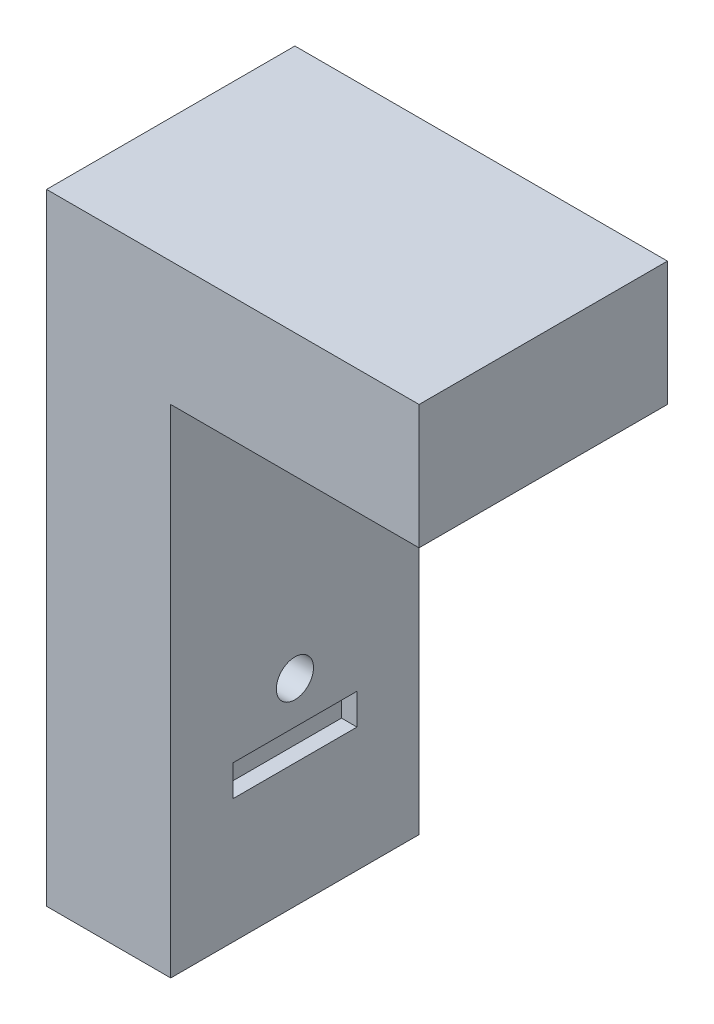
ISO-10303-21;
HEADER;
FILE_DESCRIPTION(('STEP AP214'),'2;1');
FILE_NAME('part.step','',(''),(''),'','','');
FILE_SCHEMA(('AUTOMOTIVE_DESIGN { 1 0 10303 214 1 1 1 1 }'));
ENDSEC;
DATA;
#1=APPLICATION_CONTEXT('core data for automotive mechanical design processes');
#2=APPLICATION_PROTOCOL_DEFINITION('international standard','automotive_design',2000,#1);
#3=PRODUCT_CONTEXT('',#1,'mechanical');
#4=PRODUCT('Part','Part','',(#3));
#5=PRODUCT_RELATED_PRODUCT_CATEGORY('part','',(#4));
#6=PRODUCT_DEFINITION_FORMATION('','',#4);
#7=PRODUCT_DEFINITION_CONTEXT('part definition',#1,'design');
#8=PRODUCT_DEFINITION('design','',#6,#7);
#9=PRODUCT_DEFINITION_SHAPE('','',#8);
#10=(LENGTH_UNIT() NAMED_UNIT(*) SI_UNIT(.MILLI.,.METRE.));
#11=(NAMED_UNIT(*) PLANE_ANGLE_UNIT() SI_UNIT($,.RADIAN.));
#12=(NAMED_UNIT(*) SI_UNIT($,.STERADIAN.) SOLID_ANGLE_UNIT());
#13=UNCERTAINTY_MEASURE_WITH_UNIT(LENGTH_MEASURE(1.E-05),#10,'distance_accuracy_value','');
#14=(GEOMETRIC_REPRESENTATION_CONTEXT(3) GLOBAL_UNCERTAINTY_ASSIGNED_CONTEXT((#13)) GLOBAL_UNIT_ASSIGNED_CONTEXT((#10,
#11,#12)) REPRESENTATION_CONTEXT('',''));
#15=CARTESIAN_POINT('',(0.,0.,0.));
#16=DIRECTION('',(0.,0.,1.));
#17=DIRECTION('',(1.,0.,0.));
#18=AXIS2_PLACEMENT_3D('',#15,#16,#17);
#19=CARTESIAN_POINT('',(0.,0.,-25.4));
#20=DIRECTION('',(0.,-1.,0.));
#21=DIRECTION('',(1.,0.,0.));
#22=AXIS2_PLACEMENT_3D('',#19,#20,#21);
#23=PLANE('',#22);
#24=DIRECTION('',(1.,0.,0.));
#25=VECTOR('',#24,1.);
#26=CARTESIAN_POINT('',(0.,0.,0.));
#27=LINE('',#26,#25);
#28=CARTESIAN_POINT('',(-12.7,0.,0.));
#29=VERTEX_POINT('',#28);
#30=CARTESIAN_POINT('',(0.,0.,0.));
#31=VERTEX_POINT('',#30);
#32=EDGE_CURVE('E134',#29,#31,#27,.T.);
#33=ORIENTED_EDGE('',*,*,#32,.F.);
#34=DIRECTION('',(0.,0.,1.));
#35=VECTOR('',#34,1.);
#36=CARTESIAN_POINT('',(-12.7,0.,-25.4));
#37=LINE('',#36,#35);
#38=CARTESIAN_POINT('',(-12.7,0.,-25.4));
#39=VERTEX_POINT('',#38);
#40=EDGE_CURVE('E11',#39,#29,#37,.T.);
#41=ORIENTED_EDGE('',*,*,#40,.F.);
#42=DIRECTION('',(1.,0.,0.));
#43=VECTOR('',#42,1.);
#44=CARTESIAN_POINT('',(0.,0.,-25.4));
#45=LINE('',#44,#43);
#46=CARTESIAN_POINT('',(0.,0.,-25.4));
#47=VERTEX_POINT('',#46);
#48=EDGE_CURVE('E149',#39,#47,#45,.T.);
#49=ORIENTED_EDGE('',*,*,#48,.T.);
#50=DIRECTION('',(0.,0.,1.));
#51=VECTOR('',#50,1.);
#52=CARTESIAN_POINT('',(0.,0.,-25.4));
#53=LINE('',#52,#51);
#54=EDGE_CURVE('E91',#47,#31,#53,.T.);
#55=ORIENTED_EDGE('',*,*,#54,.T.);
#56=EDGE_LOOP('',(#33,#41,#49,#55));
#57=FACE_BOUND('',#56,.T.);
#58=ADVANCED_FACE('F35',(#57),#23,.T.);
#59=CARTESIAN_POINT('',(-12.7,0.,-25.4));
#60=DIRECTION('',(-1.,0.,0.));
#61=DIRECTION('',(0.,-1.,0.));
#62=AXIS2_PLACEMENT_3D('',#59,#60,#61);
#63=PLANE('',#62);
#64=CARTESIAN_POINT('',(-12.7,20.194167156924,-12.7));
#65=DIRECTION('',(-1.,0.,0.));
#66=DIRECTION('',(0.,0.,1.));
#67=AXIS2_PLACEMENT_3D('',#64,#65,#66);
#68=CIRCLE('',#67,3.5433);
#69=CARTESIAN_POINT('',(-12.7,20.194167156924,-9.1567));
#70=VERTEX_POINT('',#69);
#71=EDGE_CURVE('E231',#70,#70,#68,.T.);
#72=ORIENTED_EDGE('',*,*,#71,.F.);
#73=EDGE_LOOP('',(#72));
#74=FACE_BOUND('',#73,.T.);
#75=DIRECTION('',(0.,-1.,0.));
#76=VECTOR('',#75,1.);
#77=CARTESIAN_POINT('',(-12.7,0.,0.));
#78=LINE('',#77,#76);
#79=CARTESIAN_POINT('',(-12.7,63.5,0.));
#80=VERTEX_POINT('',#79);
#81=EDGE_CURVE('E147',#80,#29,#78,.T.);
#82=ORIENTED_EDGE('',*,*,#81,.F.);
#83=DIRECTION('',(0.,0.,1.));
#84=VECTOR('',#83,1.);
#85=CARTESIAN_POINT('',(-12.7,63.5,-25.4));
#86=LINE('',#85,#84);
#87=CARTESIAN_POINT('',(-12.7,63.5,-25.4));
#88=VERTEX_POINT('',#87);
#89=EDGE_CURVE('E43',#88,#80,#86,.T.);
#90=ORIENTED_EDGE('',*,*,#89,.F.);
#91=DIRECTION('',(0.,-1.,0.));
#92=VECTOR('',#91,1.);
#93=CARTESIAN_POINT('',(-12.7,0.,-25.4));
#94=LINE('',#93,#92);
#95=EDGE_CURVE('E124',#88,#39,#94,.T.);
#96=ORIENTED_EDGE('',*,*,#95,.T.);
#97=ORIENTED_EDGE('',*,*,#40,.T.);
#98=EDGE_LOOP('',(#82,#90,#96,#97));
#99=FACE_BOUND('',#98,.T.);
#100=ADVANCED_FACE('F158',(#74,#99),#63,.T.);
#101=CARTESIAN_POINT('',(-12.7,63.5,-25.4));
#102=DIRECTION('',(0.,1.,0.));
#103=DIRECTION('',(0.,0.,1.));
#104=AXIS2_PLACEMENT_3D('',#101,#102,#103);
#105=PLANE('',#104);
#106=DIRECTION('',(-1.,0.,0.));
#107=VECTOR('',#106,1.);
#108=CARTESIAN_POINT('',(-12.7,63.5,0.));
#109=LINE('',#108,#107);
#110=CARTESIAN_POINT('',(25.4,63.5,0.));
#111=VERTEX_POINT('',#110);
#112=EDGE_CURVE('E111',#111,#80,#109,.T.);
#113=ORIENTED_EDGE('',*,*,#112,.F.);
#114=DIRECTION('',(0.,0.,1.));
#115=VECTOR('',#114,1.);
#116=CARTESIAN_POINT('',(25.4,63.5,-25.4));
#117=LINE('',#116,#115);
#118=CARTESIAN_POINT('',(25.4,63.5,-25.4));
#119=VERTEX_POINT('',#118);
#120=EDGE_CURVE('E105',#119,#111,#117,.T.);
#121=ORIENTED_EDGE('',*,*,#120,.F.);
#122=DIRECTION('',(-1.,0.,0.));
#123=VECTOR('',#122,1.);
#124=CARTESIAN_POINT('',(-12.7,63.5,-25.4));
#125=LINE('',#124,#123);
#126=EDGE_CURVE('E108',#119,#88,#125,.T.);
#127=ORIENTED_EDGE('',*,*,#126,.T.);
#128=ORIENTED_EDGE('',*,*,#89,.T.);
#129=EDGE_LOOP('',(#113,#121,#127,#128));
#130=FACE_BOUND('',#129,.T.);
#131=ADVANCED_FACE('F107',(#130),#105,.T.);
#132=CARTESIAN_POINT('',(25.4,63.5,-25.4));
#133=DIRECTION('',(1.,0.,0.));
#134=DIRECTION('',(0.,1.,0.));
#135=AXIS2_PLACEMENT_3D('',#132,#133,#134);
#136=PLANE('',#135);
#137=DIRECTION('',(0.,1.,0.));
#138=VECTOR('',#137,1.);
#139=CARTESIAN_POINT('',(25.4,63.5,0.));
#140=LINE('',#139,#138);
#141=CARTESIAN_POINT('',(25.4,50.8,0.));
#142=VERTEX_POINT('',#141);
#143=EDGE_CURVE('E144',#142,#111,#140,.T.);
#144=ORIENTED_EDGE('',*,*,#143,.F.);
#145=DIRECTION('',(0.,0.,1.));
#146=VECTOR('',#145,1.);
#147=CARTESIAN_POINT('',(25.4,50.8,-25.4));
#148=LINE('',#147,#146);
#149=CARTESIAN_POINT('',(25.4,50.8,-25.4));
#150=VERTEX_POINT('',#149);
#151=EDGE_CURVE('E116',#150,#142,#148,.T.);
#152=ORIENTED_EDGE('',*,*,#151,.F.);
#153=DIRECTION('',(0.,1.,0.));
#154=VECTOR('',#153,1.);
#155=CARTESIAN_POINT('',(25.4,63.5,-25.4));
#156=LINE('',#155,#154);
#157=EDGE_CURVE('E122',#150,#119,#156,.T.);
#158=ORIENTED_EDGE('',*,*,#157,.T.);
#159=ORIENTED_EDGE('',*,*,#120,.T.);
#160=EDGE_LOOP('',(#144,#152,#158,#159));
#161=FACE_BOUND('',#160,.T.);
#162=ADVANCED_FACE('F126',(#161),#136,.T.);
#163=CARTESIAN_POINT('',(25.4,50.8,-25.4));
#164=DIRECTION('',(0.,-1.,0.));
#165=DIRECTION('',(0.,0.,-1.));
#166=AXIS2_PLACEMENT_3D('',#163,#164,#165);
#167=PLANE('',#166);
#168=DIRECTION('',(1.,0.,0.));
#169=VECTOR('',#168,1.);
#170=CARTESIAN_POINT('',(25.4,50.8,0.));
#171=LINE('',#170,#169);
#172=CARTESIAN_POINT('',(0.,50.8,0.));
#173=VERTEX_POINT('',#172);
#174=EDGE_CURVE('E141',#173,#142,#171,.T.);
#175=ORIENTED_EDGE('',*,*,#174,.F.);
#176=DIRECTION('',(0.,0.,1.));
#177=VECTOR('',#176,1.);
#178=CARTESIAN_POINT('',(0.,50.8,-25.4));
#179=LINE('',#178,#177);
#180=CARTESIAN_POINT('',(0.,50.8,-25.4));
#181=VERTEX_POINT('',#180);
#182=EDGE_CURVE('E153',#181,#173,#179,.T.);
#183=ORIENTED_EDGE('',*,*,#182,.F.);
#184=DIRECTION('',(1.,0.,0.));
#185=VECTOR('',#184,1.);
#186=CARTESIAN_POINT('',(25.4,50.8,-25.4));
#187=LINE('',#186,#185);
#188=EDGE_CURVE('E127',#181,#150,#187,.T.);
#189=ORIENTED_EDGE('',*,*,#188,.T.);
#190=ORIENTED_EDGE('',*,*,#151,.T.);
#191=EDGE_LOOP('',(#175,#183,#189,#190));
#192=FACE_BOUND('',#191,.T.);
#193=ADVANCED_FACE('F173',(#192),#167,.T.);
#194=CARTESIAN_POINT('',(0.,50.8,-25.4));
#195=DIRECTION('',(1.,0.,0.));
#196=DIRECTION('',(0.,0.,-1.));
#197=AXIS2_PLACEMENT_3D('',#194,#195,#196);
#198=PLANE('',#197);
#199=CARTESIAN_POINT('',(0.,20.194167156924,-12.7));
#200=DIRECTION('',(1.,0.,0.));
#201=DIRECTION('',(0.,0.,-1.));
#202=AXIS2_PLACEMENT_3D('',#199,#200,#201);
#203=CIRCLE('',#202,1.89865);
#204=CARTESIAN_POINT('',(0.,20.194167156924,-14.59865));
#205=VERTEX_POINT('',#204);
#206=EDGE_CURVE('E38',#205,#205,#203,.T.);
#207=ORIENTED_EDGE('',*,*,#206,.F.);
#208=EDGE_LOOP('',(#207));
#209=FACE_BOUND('',#208,.T.);
#210=DIRECTION('',(0.,-1.,0.));
#211=VECTOR('',#210,1.);
#212=CARTESIAN_POINT('',(0.,12.7,-6.35));
#213=LINE('',#212,#211);
#214=CARTESIAN_POINT('',(0.,15.875,-6.35));
#215=VERTEX_POINT('',#214);
#216=CARTESIAN_POINT('',(0.,12.7,-6.35));
#217=VERTEX_POINT('',#216);
#218=EDGE_CURVE('E51',#215,#217,#213,.T.);
#219=ORIENTED_EDGE('',*,*,#218,.F.);
#220=DIRECTION('',(0.,0.,1.));
#221=VECTOR('',#220,1.);
#222=CARTESIAN_POINT('',(0.,15.875,-6.35));
#223=LINE('',#222,#221);
#224=CARTESIAN_POINT('',(0.,15.875,-19.05));
#225=VERTEX_POINT('',#224);
#226=EDGE_CURVE('E189',#225,#215,#223,.T.);
#227=ORIENTED_EDGE('',*,*,#226,.F.);
#228=DIRECTION('',(0.,1.,0.));
#229=VECTOR('',#228,1.);
#230=CARTESIAN_POINT('',(0.,12.7,-19.05));
#231=LINE('',#230,#229);
#232=CARTESIAN_POINT('',(0.,12.7,-19.05));
#233=VERTEX_POINT('',#232);
#234=EDGE_CURVE('E194',#233,#225,#231,.T.);
#235=ORIENTED_EDGE('',*,*,#234,.F.);
#236=DIRECTION('',(0.,0.,-1.));
#237=VECTOR('',#236,1.);
#238=CARTESIAN_POINT('',(0.,12.7,-6.35));
#239=LINE('',#238,#237);
#240=EDGE_CURVE('E191',#217,#233,#239,.T.);
#241=ORIENTED_EDGE('',*,*,#240,.F.);
#242=EDGE_LOOP('',(#219,#227,#235,#241));
#243=FACE_BOUND('',#242,.T.);
#244=DIRECTION('',(0.,1.,0.));
#245=VECTOR('',#244,1.);
#246=CARTESIAN_POINT('',(0.,50.8,0.));
#247=LINE('',#246,#245);
#248=EDGE_CURVE('E137',#31,#173,#247,.T.);
#249=ORIENTED_EDGE('',*,*,#248,.F.);
#250=ORIENTED_EDGE('',*,*,#54,.F.);
#251=DIRECTION('',(0.,1.,0.));
#252=VECTOR('',#251,1.);
#253=CARTESIAN_POINT('',(0.,50.8,-25.4));
#254=LINE('',#253,#252);
#255=EDGE_CURVE('E129',#47,#181,#254,.T.);
#256=ORIENTED_EDGE('',*,*,#255,.T.);
#257=ORIENTED_EDGE('',*,*,#182,.T.);
#258=EDGE_LOOP('',(#249,#250,#256,#257));
#259=FACE_BOUND('',#258,.T.);
#260=ADVANCED_FACE('F154',(#209,#243,#259),#198,.T.);
#261=CARTESIAN_POINT('',(0.,0.,-25.4));
#262=DIRECTION('',(0.,0.,-1.));
#263=DIRECTION('',(-1.,0.,0.));
#264=AXIS2_PLACEMENT_3D('',#261,#262,#263);
#265=PLANE('',#264);
#266=ORIENTED_EDGE('',*,*,#48,.F.);
#267=ORIENTED_EDGE('',*,*,#95,.F.);
#268=ORIENTED_EDGE('',*,*,#126,.F.);
#269=ORIENTED_EDGE('',*,*,#157,.F.);
#270=ORIENTED_EDGE('',*,*,#188,.F.);
#271=ORIENTED_EDGE('',*,*,#255,.F.);
#272=EDGE_LOOP('',(#266,#267,#268,#269,#270,#271));
#273=FACE_BOUND('',#272,.T.);
#274=ADVANCED_FACE('F120',(#273),#265,.T.);
#275=CARTESIAN_POINT('',(0.,0.,0.));
#276=DIRECTION('',(0.,0.,-1.));
#277=DIRECTION('',(-1.,0.,0.));
#278=AXIS2_PLACEMENT_3D('',#275,#276,#277);
#279=PLANE('',#278);
#280=ORIENTED_EDGE('',*,*,#32,.T.);
#281=ORIENTED_EDGE('',*,*,#248,.T.);
#282=ORIENTED_EDGE('',*,*,#174,.T.);
#283=ORIENTED_EDGE('',*,*,#143,.T.);
#284=ORIENTED_EDGE('',*,*,#112,.T.);
#285=ORIENTED_EDGE('',*,*,#81,.T.);
#286=EDGE_LOOP('',(#280,#281,#282,#283,#284,#285));
#287=FACE_BOUND('',#286,.T.);
#288=ADVANCED_FACE('F157',(#287),#279,.F.);
#289=CARTESIAN_POINT('',(-1.5875,12.7,-6.35));
#290=DIRECTION('',(0.,0.,1.));
#291=DIRECTION('',(1.,0.,0.));
#292=AXIS2_PLACEMENT_3D('',#289,#290,#291);
#293=PLANE('',#292);
#294=ORIENTED_EDGE('',*,*,#218,.T.);
#295=DIRECTION('',(1.,0.,0.));
#296=VECTOR('',#295,1.);
#297=CARTESIAN_POINT('',(-1.5875,12.7,-6.35));
#298=LINE('',#297,#296);
#299=CARTESIAN_POINT('',(-1.5875,12.7,-6.35));
#300=VERTEX_POINT('',#299);
#301=EDGE_CURVE('E212',#300,#217,#298,.T.);
#302=ORIENTED_EDGE('',*,*,#301,.F.);
#303=DIRECTION('',(0.,-1.,0.));
#304=VECTOR('',#303,1.);
#305=CARTESIAN_POINT('',(-1.5875,12.7,-6.35));
#306=LINE('',#305,#304);
#307=CARTESIAN_POINT('',(-1.5875,15.875,-6.35));
#308=VERTEX_POINT('',#307);
#309=EDGE_CURVE('E204',#308,#300,#306,.T.);
#310=ORIENTED_EDGE('',*,*,#309,.F.);
#311=DIRECTION('',(1.,0.,0.));
#312=VECTOR('',#311,1.);
#313=CARTESIAN_POINT('',(-1.5875,15.875,-6.35));
#314=LINE('',#313,#312);
#315=EDGE_CURVE('E138',#308,#215,#314,.T.);
#316=ORIENTED_EDGE('',*,*,#315,.T.);
#317=EDGE_LOOP('',(#294,#302,#310,#316));
#318=FACE_BOUND('',#317,.T.);
#319=ADVANCED_FACE('F254',(#318),#293,.F.);
#320=CARTESIAN_POINT('',(-1.5875,15.875,-6.35));
#321=DIRECTION('',(0.,1.,0.));
#322=DIRECTION('',(-1.,0.,0.));
#323=AXIS2_PLACEMENT_3D('',#320,#321,#322);
#324=PLANE('',#323);
#325=ORIENTED_EDGE('',*,*,#226,.T.);
#326=ORIENTED_EDGE('',*,*,#315,.F.);
#327=DIRECTION('',(0.,0.,1.));
#328=VECTOR('',#327,1.);
#329=CARTESIAN_POINT('',(-1.5875,15.875,-6.35));
#330=LINE('',#329,#328);
#331=CARTESIAN_POINT('',(-1.5875,15.875,-19.05));
#332=VERTEX_POINT('',#331);
#333=EDGE_CURVE('E198',#332,#308,#330,.T.);
#334=ORIENTED_EDGE('',*,*,#333,.F.);
#335=DIRECTION('',(1.,0.,0.));
#336=VECTOR('',#335,1.);
#337=CARTESIAN_POINT('',(-1.5875,15.875,-19.05));
#338=LINE('',#337,#336);
#339=EDGE_CURVE('E206',#332,#225,#338,.T.);
#340=ORIENTED_EDGE('',*,*,#339,.T.);
#341=EDGE_LOOP('',(#325,#326,#334,#340));
#342=FACE_BOUND('',#341,.T.);
#343=ADVANCED_FACE('F250',(#342),#324,.F.);
#344=CARTESIAN_POINT('',(-1.5875,12.7,-19.05));
#345=DIRECTION('',(0.,0.,-1.));
#346=DIRECTION('',(-1.,0.,0.));
#347=AXIS2_PLACEMENT_3D('',#344,#345,#346);
#348=PLANE('',#347);
#349=ORIENTED_EDGE('',*,*,#234,.T.);
#350=ORIENTED_EDGE('',*,*,#339,.F.);
#351=DIRECTION('',(0.,1.,0.));
#352=VECTOR('',#351,1.);
#353=CARTESIAN_POINT('',(-1.5875,12.7,-19.05));
#354=LINE('',#353,#352);
#355=CARTESIAN_POINT('',(-1.5875,12.7,-19.05));
#356=VERTEX_POINT('',#355);
#357=EDGE_CURVE('E217',#356,#332,#354,.T.);
#358=ORIENTED_EDGE('',*,*,#357,.F.);
#359=DIRECTION('',(1.,0.,0.));
#360=VECTOR('',#359,1.);
#361=CARTESIAN_POINT('',(-1.5875,12.7,-19.05));
#362=LINE('',#361,#360);
#363=EDGE_CURVE('E209',#356,#233,#362,.T.);
#364=ORIENTED_EDGE('',*,*,#363,.T.);
#365=EDGE_LOOP('',(#349,#350,#358,#364));
#366=FACE_BOUND('',#365,.T.);
#367=ADVANCED_FACE('F253',(#366),#348,.F.);
#368=CARTESIAN_POINT('',(-1.5875,12.7,-6.35));
#369=DIRECTION('',(0.,-1.,0.));
#370=DIRECTION('',(1.,0.,0.));
#371=AXIS2_PLACEMENT_3D('',#368,#369,#370);
#372=PLANE('',#371);
#373=ORIENTED_EDGE('',*,*,#240,.T.);
#374=ORIENTED_EDGE('',*,*,#363,.F.);
#375=DIRECTION('',(0.,0.,-1.));
#376=VECTOR('',#375,1.);
#377=CARTESIAN_POINT('',(-1.5875,12.7,-6.35));
#378=LINE('',#377,#376);
#379=EDGE_CURVE('E222',#300,#356,#378,.T.);
#380=ORIENTED_EDGE('',*,*,#379,.F.);
#381=ORIENTED_EDGE('',*,*,#301,.T.);
#382=EDGE_LOOP('',(#373,#374,#380,#381));
#383=FACE_BOUND('',#382,.T.);
#384=ADVANCED_FACE('F249',(#383),#372,.F.);
#385=CARTESIAN_POINT('',(-1.5875,0.,0.));
#386=DIRECTION('',(-1.,0.,0.));
#387=DIRECTION('',(0.,-1.,0.));
#388=AXIS2_PLACEMENT_3D('',#385,#386,#387);
#389=PLANE('',#388);
#390=ORIENTED_EDGE('',*,*,#309,.T.);
#391=ORIENTED_EDGE('',*,*,#379,.T.);
#392=ORIENTED_EDGE('',*,*,#357,.T.);
#393=ORIENTED_EDGE('',*,*,#333,.T.);
#394=EDGE_LOOP('',(#390,#391,#392,#393));
#395=FACE_BOUND('',#394,.T.);
#396=ADVANCED_FACE('F242',(#395),#389,.F.);
#397=CARTESIAN_POINT('',(-12.7,20.194167156924,-12.7));
#398=DIRECTION('',(-1.,0.,0.));
#399=DIRECTION('',(0.,0.,1.));
#400=AXIS2_PLACEMENT_3D('',#397,#398,#399);
#401=CYLINDRICAL_SURFACE('',#400,1.89865);
#402=ORIENTED_EDGE('',*,*,#206,.T.);
#403=EDGE_LOOP('',(#402));
#404=FACE_BOUND('',#403,.T.);
#405=CARTESIAN_POINT('',(-11.3199747915843,20.194167156924,-12.7));
#406=DIRECTION('',(-1.,0.,0.));
#407=DIRECTION('',(0.,0.,1.));
#408=AXIS2_PLACEMENT_3D('',#405,#406,#407);
#409=CIRCLE('',#408,1.89865);
#410=CARTESIAN_POINT('',(-11.3199747915843,20.194167156924,-10.80135));
#411=VERTEX_POINT('',#410);
#412=EDGE_CURVE('E196',#411,#411,#409,.T.);
#413=ORIENTED_EDGE('',*,*,#412,.T.);
#414=EDGE_LOOP('',(#413));
#415=FACE_BOUND('',#414,.T.);
#416=ADVANCED_FACE('F236',(#404,#415),#401,.F.);
#417=CARTESIAN_POINT('',(-12.7,20.194167156924,-12.7));
#418=DIRECTION('',(-1.,0.,0.));
#419=DIRECTION('',(0.,0.,1.));
#420=AXIS2_PLACEMENT_3D('',#417,#418,#419);
#421=CONICAL_SURFACE('',#420,3.5433,0.872664625997164);
#422=ORIENTED_EDGE('',*,*,#412,.F.);
#423=EDGE_LOOP('',(#422));
#424=FACE_BOUND('',#423,.T.);
#425=ORIENTED_EDGE('',*,*,#71,.T.);
#426=EDGE_LOOP('',(#425));
#427=FACE_BOUND('',#426,.T.);
#428=ADVANCED_FACE('F234',(#424,#427),#421,.F.);
#429=CLOSED_SHELL('',(#58,#100,#131,#162,#193,#260,#274,#288,#319,#343,#367,#384,#396,#416,#428));
#430=MANIFOLD_SOLID_BREP('B2',#429);
#431=ADVANCED_BREP_SHAPE_REPRESENTATION('',(#18,#430),#14);
#432=SHAPE_DEFINITION_REPRESENTATION(#9,#431);
ENDSEC;
END-ISO-10303-21;
